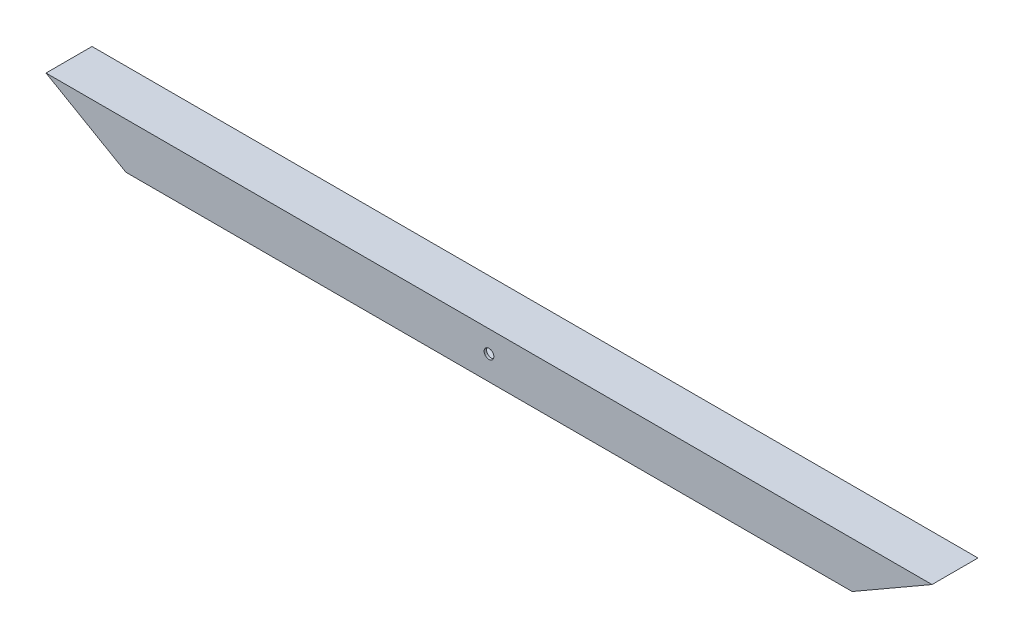
ISO-10303-21;
HEADER;
FILE_DESCRIPTION(('STEP AP214'),'2;1');
FILE_NAME('part.step','',(''),(''),'','','');
FILE_SCHEMA(('AUTOMOTIVE_DESIGN { 1 0 10303 214 1 1 1 1 }'));
ENDSEC;
DATA;
#1=APPLICATION_CONTEXT('core data for automotive mechanical design processes');
#2=APPLICATION_PROTOCOL_DEFINITION('international standard','automotive_design',2000,#1);
#3=PRODUCT_CONTEXT('',#1,'mechanical');
#4=PRODUCT('Part','Part','',(#3));
#5=PRODUCT_RELATED_PRODUCT_CATEGORY('part','',(#4));
#6=PRODUCT_DEFINITION_FORMATION('','',#4);
#7=PRODUCT_DEFINITION_CONTEXT('part definition',#1,'design');
#8=PRODUCT_DEFINITION('design','',#6,#7);
#9=PRODUCT_DEFINITION_SHAPE('','',#8);
#10=(LENGTH_UNIT() NAMED_UNIT(*) SI_UNIT(.MILLI.,.METRE.));
#11=(NAMED_UNIT(*) PLANE_ANGLE_UNIT() SI_UNIT($,.RADIAN.));
#12=(NAMED_UNIT(*) SI_UNIT($,.STERADIAN.) SOLID_ANGLE_UNIT());
#13=UNCERTAINTY_MEASURE_WITH_UNIT(LENGTH_MEASURE(1.E-05),#10,'distance_accuracy_value','');
#14=(GEOMETRIC_REPRESENTATION_CONTEXT(3) GLOBAL_UNCERTAINTY_ASSIGNED_CONTEXT((#13)) GLOBAL_UNIT_ASSIGNED_CONTEXT((#10,
#11,#12)) REPRESENTATION_CONTEXT('',''));
#15=CARTESIAN_POINT('',(0.,0.,0.));
#16=DIRECTION('',(0.,0.,1.));
#17=DIRECTION('',(1.,0.,0.));
#18=AXIS2_PLACEMENT_3D('',#15,#16,#17);
#19=CARTESIAN_POINT('',(-336.935643564356,0.999999999999997,-1.));
#20=DIRECTION('',(0.,-1.,0.));
#21=DIRECTION('',(0.,0.,-1.));
#22=AXIS2_PLACEMENT_3D('',#19,#20,#21);
#23=PLANE('',#22);
#24=DIRECTION('',(1.,0.,0.));
#25=VECTOR('',#24,1.);
#26=CARTESIAN_POINT('',(-336.935643564356,0.999999999999997,-1.));
#27=LINE('',#26,#25);
#28=CARTESIAN_POINT('',(-305.67248566962,0.999999999999997,-1.));
#29=VERTEX_POINT('',#28);
#30=CARTESIAN_POINT('',(-2.19880145909329,0.999999999999997,-1.));
#31=VERTEX_POINT('',#30);
#32=EDGE_CURVE('E147',#29,#31,#27,.T.);
#33=ORIENTED_EDGE('',*,*,#32,.T.);
#34=DIRECTION('',(0.,0.,-1.));
#35=VECTOR('',#34,1.);
#36=CARTESIAN_POINT('',(-2.19880145909329,0.999999999999997,-1.));
#37=LINE('',#36,#35);
#38=CARTESIAN_POINT('',(-2.19880145909329,0.999999999999997,-18.));
#39=VERTEX_POINT('',#38);
#40=EDGE_CURVE('E11',#31,#39,#37,.T.);
#41=ORIENTED_EDGE('',*,*,#40,.T.);
#42=DIRECTION('',(1.,0.,0.));
#43=VECTOR('',#42,1.);
#44=CARTESIAN_POINT('',(-336.935643564356,0.999999999999997,-18.));
#45=LINE('',#44,#43);
#46=CARTESIAN_POINT('',(-305.67248566962,0.999999999999997,-18.));
#47=VERTEX_POINT('',#46);
#48=EDGE_CURVE('E139',#47,#39,#45,.T.);
#49=ORIENTED_EDGE('',*,*,#48,.F.);
#50=DIRECTION('',(0.,0.,-1.));
#51=VECTOR('',#50,1.);
#52=CARTESIAN_POINT('',(-305.67248566962,0.999999999999997,-1.));
#53=LINE('',#52,#51);
#54=EDGE_CURVE('E42',#29,#47,#53,.T.);
#55=ORIENTED_EDGE('',*,*,#54,.F.);
#56=EDGE_LOOP('',(#33,#41,#49,#55));
#57=FACE_BOUND('',#56,.T.);
#58=ADVANCED_FACE('F34',(#57),#23,.F.);
#59=CARTESIAN_POINT('',(-336.935643564356,18.,-18.));
#60=DIRECTION('',(0.,0.,-1.));
#61=DIRECTION('',(0.,1.,0.));
#62=AXIS2_PLACEMENT_3D('',#59,#60,#61);
#63=PLANE('',#62);
#64=CARTESIAN_POINT('',(-153.935643564356,10.,-18.));
#65=DIRECTION('',(0.,0.,-1.));
#66=DIRECTION('',(0.,1.,0.));
#67=AXIS2_PLACEMENT_3D('',#64,#65,#66);
#68=CIRCLE('',#67,2.);
#69=CARTESIAN_POINT('',(-153.935643564356,12.,-18.));
#70=VERTEX_POINT('',#69);
#71=EDGE_CURVE('E150',#70,#70,#68,.T.);
#72=ORIENTED_EDGE('',*,*,#71,.T.);
#73=EDGE_LOOP('',(#72));
#74=FACE_BOUND('',#73,.T.);
#75=ORIENTED_EDGE('',*,*,#48,.T.);
#76=DIRECTION('',(0.866622456874169,0.498964444866946,0.));
#77=VECTOR('',#76,1.);
#78=CARTESIAN_POINT('',(-246.246678047115,-139.512413793103,-18.));
#79=LINE('',#78,#77);
#80=CARTESIAN_POINT('',(27.3275143303804,18.,-18.));
#81=VERTEX_POINT('',#80);
#82=EDGE_CURVE('E166',#39,#81,#79,.T.);
#83=ORIENTED_EDGE('',*,*,#82,.T.);
#84=DIRECTION('',(1.,0.,0.));
#85=VECTOR('',#84,1.);
#86=CARTESIAN_POINT('',(-336.935643564356,18.,-18.));
#87=LINE('',#86,#85);
#88=CARTESIAN_POINT('',(-335.198801459093,18.,-18.));
#89=VERTEX_POINT('',#88);
#90=EDGE_CURVE('E132',#89,#81,#87,.T.);
#91=ORIENTED_EDGE('',*,*,#90,.F.);
#92=DIRECTION('',(-0.866622456874169,0.498964444866945,0.));
#93=VECTOR('',#92,1.);
#94=CARTESIAN_POINT('',(-336.503229771253,18.7510344827586,-18.));
#95=LINE('',#94,#93);
#96=EDGE_CURVE('E160',#47,#89,#95,.T.);
#97=ORIENTED_EDGE('',*,*,#96,.F.);
#98=EDGE_LOOP('',(#75,#83,#91,#97));
#99=FACE_BOUND('',#98,.T.);
#100=ADVANCED_FACE('F182',(#74,#99),#63,.F.);
#101=CARTESIAN_POINT('',(-336.935643564356,18.,-1.));
#102=DIRECTION('',(0.,1.,0.));
#103=DIRECTION('',(0.,0.,1.));
#104=AXIS2_PLACEMENT_3D('',#101,#102,#103);
#105=PLANE('',#104);
#106=ORIENTED_EDGE('',*,*,#90,.T.);
#107=DIRECTION('',(0.,0.,1.));
#108=VECTOR('',#107,1.);
#109=CARTESIAN_POINT('',(27.3275143303804,18.,-1.));
#110=LINE('',#109,#108);
#111=CARTESIAN_POINT('',(27.3275143303804,18.,-1.));
#112=VERTEX_POINT('',#111);
#113=EDGE_CURVE('E168',#81,#112,#110,.T.);
#114=ORIENTED_EDGE('',*,*,#113,.T.);
#115=DIRECTION('',(1.,0.,0.));
#116=VECTOR('',#115,1.);
#117=CARTESIAN_POINT('',(-336.935643564356,18.,-1.));
#118=LINE('',#117,#116);
#119=CARTESIAN_POINT('',(-335.198801459093,18.,-1.));
#120=VERTEX_POINT('',#119);
#121=EDGE_CURVE('E128',#120,#112,#118,.T.);
#122=ORIENTED_EDGE('',*,*,#121,.F.);
#123=DIRECTION('',(0.,0.,1.));
#124=VECTOR('',#123,1.);
#125=CARTESIAN_POINT('',(-335.198801459093,18.,-1.));
#126=LINE('',#125,#124);
#127=EDGE_CURVE('E162',#89,#120,#126,.T.);
#128=ORIENTED_EDGE('',*,*,#127,.F.);
#129=EDGE_LOOP('',(#106,#114,#122,#128));
#130=FACE_BOUND('',#129,.T.);
#131=ADVANCED_FACE('F183',(#130),#105,.F.);
#132=CARTESIAN_POINT('',(-336.935643564356,18.,-1.));
#133=DIRECTION('',(0.,0.,1.));
#134=DIRECTION('',(0.,-1.,0.));
#135=AXIS2_PLACEMENT_3D('',#132,#133,#134);
#136=PLANE('',#135);
#137=CARTESIAN_POINT('',(-153.935643564356,10.,-1.));
#138=DIRECTION('',(0.,0.,1.));
#139=DIRECTION('',(0.,-1.,0.));
#140=AXIS2_PLACEMENT_3D('',#137,#138,#139);
#141=CIRCLE('',#140,2.);
#142=CARTESIAN_POINT('',(-153.935643564356,8.,-1.));
#143=VERTEX_POINT('',#142);
#144=EDGE_CURVE('E155',#143,#143,#141,.T.);
#145=ORIENTED_EDGE('',*,*,#144,.T.);
#146=EDGE_LOOP('',(#145));
#147=FACE_BOUND('',#146,.T.);
#148=ORIENTED_EDGE('',*,*,#121,.T.);
#149=DIRECTION('',(-0.866622456874169,-0.498964444866946,0.));
#150=VECTOR('',#149,1.);
#151=CARTESIAN_POINT('',(-246.246678047115,-139.512413793103,-1.00000000000002));
#152=LINE('',#151,#150);
#153=EDGE_CURVE('E142',#112,#31,#152,.T.);
#154=ORIENTED_EDGE('',*,*,#153,.T.);
#155=ORIENTED_EDGE('',*,*,#32,.F.);
#156=DIRECTION('',(0.866622456874169,-0.498964444866945,0.));
#157=VECTOR('',#156,1.);
#158=CARTESIAN_POINT('',(-336.503229771253,18.7510344827586,-1.));
#159=LINE('',#158,#157);
#160=EDGE_CURVE('E164',#120,#29,#159,.T.);
#161=ORIENTED_EDGE('',*,*,#160,.F.);
#162=EDGE_LOOP('',(#148,#154,#155,#161));
#163=FACE_BOUND('',#162,.T.);
#164=ADVANCED_FACE('F172',(#147,#163),#136,.F.);
#165=CARTESIAN_POINT('',(-75.6694947080914,-131.425964493001,0.));
#166=DIRECTION('',(-0.498964444866945,-0.866622456874169,0.));
#167=DIRECTION('',(0.866622456874169,-0.498964444866945,0.));
#168=AXIS2_PLACEMENT_3D('',#165,#166,#167);
#169=PLANE('',#168);
#170=DIRECTION('',(-0.866622456874169,0.498964444866945,0.));
#171=VECTOR('',#170,1.);
#172=CARTESIAN_POINT('',(-75.6694947080914,-131.425964493001,-19.));
#173=LINE('',#172,#171);
#174=CARTESIAN_POINT('',(-303.935643564356,0.,-19.));
#175=VERTEX_POINT('',#174);
#176=CARTESIAN_POINT('',(-336.935643564356,19.,-19.));
#177=VERTEX_POINT('',#176);
#178=EDGE_CURVE('E49',#175,#177,#173,.T.);
#179=ORIENTED_EDGE('',*,*,#178,.F.);
#180=DIRECTION('',(0.,0.,-1.));
#181=VECTOR('',#180,1.);
#182=CARTESIAN_POINT('',(-303.935643564356,0.,0.));
#183=LINE('',#182,#181);
#184=CARTESIAN_POINT('',(-303.935643564356,0.,0.));
#185=VERTEX_POINT('',#184);
#186=EDGE_CURVE('E152',#185,#175,#183,.T.);
#187=ORIENTED_EDGE('',*,*,#186,.F.);
#188=DIRECTION('',(-0.866622456874169,0.498964444866945,0.));
#189=VECTOR('',#188,1.);
#190=CARTESIAN_POINT('',(-75.6694947080914,-131.425964493001,0.));
#191=LINE('',#190,#189);
#192=CARTESIAN_POINT('',(-336.935643564356,19.,0.));
#193=VERTEX_POINT('',#192);
#194=EDGE_CURVE('E149',#185,#193,#191,.T.);
#195=ORIENTED_EDGE('',*,*,#194,.T.);
#196=DIRECTION('',(0.,0.,1.));
#197=VECTOR('',#196,1.);
#198=CARTESIAN_POINT('',(-336.935643564356,19.,-19.));
#199=LINE('',#198,#197);
#200=EDGE_CURVE('E120',#177,#193,#199,.T.);
#201=ORIENTED_EDGE('',*,*,#200,.F.);
#202=EDGE_LOOP('',(#179,#187,#195,#201));
#203=FACE_BOUND('',#202,.T.);
#204=ORIENTED_EDGE('',*,*,#160,.T.);
#205=ORIENTED_EDGE('',*,*,#54,.T.);
#206=ORIENTED_EDGE('',*,*,#96,.T.);
#207=ORIENTED_EDGE('',*,*,#127,.T.);
#208=EDGE_LOOP('',(#204,#205,#206,#207));
#209=FACE_BOUND('',#208,.T.);
#210=ADVANCED_FACE('F178',(#203,#209),#169,.T.);
#211=CARTESIAN_POINT('',(-0.979839535677707,1.70182656196654,0.));
#212=DIRECTION('',(-0.498964444866946,0.866622456874169,0.));
#213=DIRECTION('',(-0.866622456874169,-0.498964444866946,0.));
#214=AXIS2_PLACEMENT_3D('',#211,#212,#213);
#215=PLANE('',#214);
#216=DIRECTION('',(0.866622456874169,0.498964444866946,0.));
#217=VECTOR('',#216,1.);
#218=CARTESIAN_POINT('',(-0.979839535677707,1.70182656196654,-19.));
#219=LINE('',#218,#217);
#220=CARTESIAN_POINT('',(-3.93564356435644,0.,-19.));
#221=VERTEX_POINT('',#220);
#222=CARTESIAN_POINT('',(29.0643564356436,19.,-19.));
#223=VERTEX_POINT('',#222);
#224=EDGE_CURVE('E101',#221,#223,#219,.T.);
#225=ORIENTED_EDGE('',*,*,#224,.T.);
#226=DIRECTION('',(0.,0.,-1.));
#227=VECTOR('',#226,1.);
#228=CARTESIAN_POINT('',(29.0643564356436,19.,-19.));
#229=LINE('',#228,#227);
#230=CARTESIAN_POINT('',(29.0643564356436,19.,0.));
#231=VERTEX_POINT('',#230);
#232=EDGE_CURVE('E97',#231,#223,#229,.T.);
#233=ORIENTED_EDGE('',*,*,#232,.F.);
#234=DIRECTION('',(0.866622456874169,0.498964444866946,0.));
#235=VECTOR('',#234,1.);
#236=CARTESIAN_POINT('',(-0.979839535677707,1.70182656196654,0.));
#237=LINE('',#236,#235);
#238=CARTESIAN_POINT('',(-3.93564356435644,0.,0.));
#239=VERTEX_POINT('',#238);
#240=EDGE_CURVE('E57',#239,#231,#237,.T.);
#241=ORIENTED_EDGE('',*,*,#240,.F.);
#242=DIRECTION('',(0.,0.,-1.));
#243=VECTOR('',#242,1.);
#244=CARTESIAN_POINT('',(-3.93564356435644,0.,0.));
#245=LINE('',#244,#243);
#246=EDGE_CURVE('E116',#239,#221,#245,.T.);
#247=ORIENTED_EDGE('',*,*,#246,.T.);
#248=EDGE_LOOP('',(#225,#233,#241,#247));
#249=FACE_BOUND('',#248,.T.);
#250=ORIENTED_EDGE('',*,*,#113,.F.);
#251=ORIENTED_EDGE('',*,*,#82,.F.);
#252=ORIENTED_EDGE('',*,*,#40,.F.);
#253=ORIENTED_EDGE('',*,*,#153,.F.);
#254=EDGE_LOOP('',(#250,#251,#252,#253));
#255=FACE_BOUND('',#254,.T.);
#256=ADVANCED_FACE('F98',(#249,#255),#215,.F.);
#257=CARTESIAN_POINT('',(-336.935643564356,19.,-19.));
#258=DIRECTION('',(0.,0.,1.));
#259=DIRECTION('',(1.,0.,0.));
#260=AXIS2_PLACEMENT_3D('',#257,#258,#259);
#261=PLANE('',#260);
#262=CARTESIAN_POINT('',(-153.935643564356,10.,-19.));
#263=DIRECTION('',(0.,0.,1.));
#264=DIRECTION('',(1.,0.,0.));
#265=AXIS2_PLACEMENT_3D('',#262,#263,#264);
#266=CIRCLE('',#265,2.);
#267=CARTESIAN_POINT('',(-151.935643564356,10.,-19.));
#268=VERTEX_POINT('',#267);
#269=EDGE_CURVE('E216',#268,#268,#266,.T.);
#270=ORIENTED_EDGE('',*,*,#269,.T.);
#271=EDGE_LOOP('',(#270));
#272=FACE_BOUND('',#271,.T.);
#273=DIRECTION('',(-1.,0.,0.));
#274=VECTOR('',#273,1.);
#275=CARTESIAN_POINT('',(-336.935643564356,19.,-19.));
#276=LINE('',#275,#274);
#277=EDGE_CURVE('E106',#223,#177,#276,.T.);
#278=ORIENTED_EDGE('',*,*,#277,.F.);
#279=ORIENTED_EDGE('',*,*,#224,.F.);
#280=DIRECTION('',(-1.,0.,0.));
#281=VECTOR('',#280,1.);
#282=CARTESIAN_POINT('',(-336.935643564356,0.,-19.));
#283=LINE('',#282,#281);
#284=EDGE_CURVE('E125',#221,#175,#283,.T.);
#285=ORIENTED_EDGE('',*,*,#284,.T.);
#286=ORIENTED_EDGE('',*,*,#178,.T.);
#287=EDGE_LOOP('',(#278,#279,#285,#286));
#288=FACE_BOUND('',#287,.T.);
#289=ADVANCED_FACE('F36',(#272,#288),#261,.F.);
#290=CARTESIAN_POINT('',(-336.935643564356,19.,0.));
#291=DIRECTION('',(0.,0.,-1.));
#292=DIRECTION('',(-1.,0.,0.));
#293=AXIS2_PLACEMENT_3D('',#290,#291,#292);
#294=PLANE('',#293);
#295=CARTESIAN_POINT('',(-153.935643564356,10.,0.));
#296=DIRECTION('',(0.,0.,1.));
#297=DIRECTION('',(1.,0.,0.));
#298=AXIS2_PLACEMENT_3D('',#295,#296,#297);
#299=CIRCLE('',#298,2.);
#300=CARTESIAN_POINT('',(-151.935643564356,10.,0.));
#301=VERTEX_POINT('',#300);
#302=EDGE_CURVE('E214',#301,#301,#299,.T.);
#303=ORIENTED_EDGE('',*,*,#302,.F.);
#304=EDGE_LOOP('',(#303));
#305=FACE_BOUND('',#304,.T.);
#306=DIRECTION('',(1.,0.,0.));
#307=VECTOR('',#306,1.);
#308=CARTESIAN_POINT('',(-336.935643564356,0.,0.));
#309=LINE('',#308,#307);
#310=EDGE_CURVE('E107',#185,#239,#309,.T.);
#311=ORIENTED_EDGE('',*,*,#310,.T.);
#312=ORIENTED_EDGE('',*,*,#240,.T.);
#313=DIRECTION('',(1.,0.,0.));
#314=VECTOR('',#313,1.);
#315=CARTESIAN_POINT('',(-336.935643564356,19.,0.));
#316=LINE('',#315,#314);
#317=EDGE_CURVE('E114',#193,#231,#316,.T.);
#318=ORIENTED_EDGE('',*,*,#317,.F.);
#319=ORIENTED_EDGE('',*,*,#194,.F.);
#320=EDGE_LOOP('',(#311,#312,#318,#319));
#321=FACE_BOUND('',#320,.T.);
#322=ADVANCED_FACE('F112',(#305,#321),#294,.F.);
#323=CARTESIAN_POINT('',(0.,0.,0.));
#324=DIRECTION('',(0.,1.,0.));
#325=DIRECTION('',(0.,0.,1.));
#326=AXIS2_PLACEMENT_3D('',#323,#324,#325);
#327=PLANE('',#326);
#328=ORIENTED_EDGE('',*,*,#284,.F.);
#329=ORIENTED_EDGE('',*,*,#246,.F.);
#330=ORIENTED_EDGE('',*,*,#310,.F.);
#331=ORIENTED_EDGE('',*,*,#186,.T.);
#332=EDGE_LOOP('',(#328,#329,#330,#331));
#333=FACE_BOUND('',#332,.T.);
#334=ADVANCED_FACE('F203',(#333),#327,.F.);
#335=CARTESIAN_POINT('',(0.,19.,0.));
#336=DIRECTION('',(0.,1.,0.));
#337=DIRECTION('',(0.,0.,1.));
#338=AXIS2_PLACEMENT_3D('',#335,#336,#337);
#339=PLANE('',#338);
#340=ORIENTED_EDGE('',*,*,#232,.T.);
#341=ORIENTED_EDGE('',*,*,#277,.T.);
#342=ORIENTED_EDGE('',*,*,#200,.T.);
#343=ORIENTED_EDGE('',*,*,#317,.T.);
#344=EDGE_LOOP('',(#340,#341,#342,#343));
#345=FACE_BOUND('',#344,.T.);
#346=ADVANCED_FACE('F119',(#345),#339,.T.);
#347=CARTESIAN_POINT('',(-153.935643564356,10.,-19.));
#348=DIRECTION('',(0.,0.,1.));
#349=DIRECTION('',(1.,0.,0.));
#350=AXIS2_PLACEMENT_3D('',#347,#348,#349);
#351=CYLINDRICAL_SURFACE('',#350,2.);
#352=ORIENTED_EDGE('',*,*,#302,.T.);
#353=EDGE_LOOP('',(#352));
#354=FACE_BOUND('',#353,.T.);
#355=ORIENTED_EDGE('',*,*,#144,.F.);
#356=EDGE_LOOP('',(#355));
#357=FACE_BOUND('',#356,.T.);
#358=ADVANCED_FACE('F202',(#354,#357),#351,.F.);
#359=ORIENTED_EDGE('',*,*,#269,.F.);
#360=EDGE_LOOP('',(#359));
#361=FACE_BOUND('',#360,.T.);
#362=ORIENTED_EDGE('',*,*,#71,.F.);
#363=EDGE_LOOP('',(#362));
#364=FACE_BOUND('',#363,.T.);
#365=ADVANCED_FACE('F229',(#361,#364),#351,.F.);
#366=CLOSED_SHELL('',(#58,#100,#131,#164,#210,#256,#289,#322,#334,#346,#358,#365));
#367=MANIFOLD_SOLID_BREP('B2',#366);
#368=ADVANCED_BREP_SHAPE_REPRESENTATION('',(#18,#367),#14);
#369=SHAPE_DEFINITION_REPRESENTATION(#9,#368);
ENDSEC;
END-ISO-10303-21;
